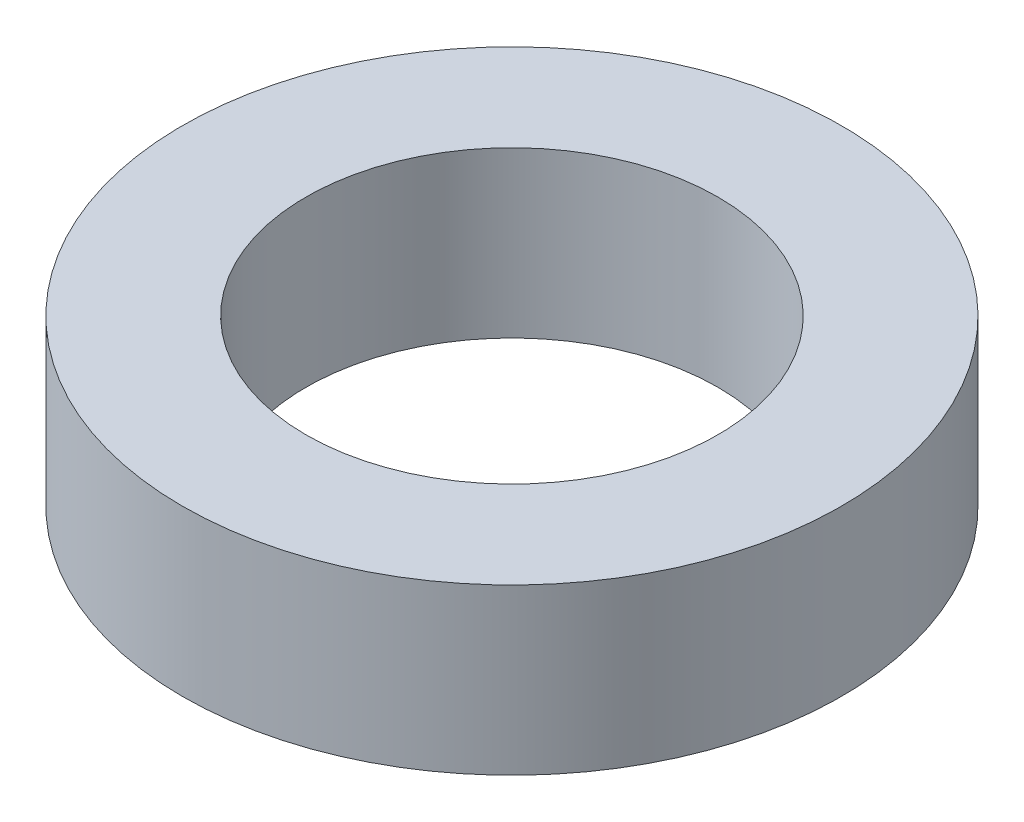
ISO-10303-21;
HEADER;
FILE_DESCRIPTION(('STEP AP214'),'2;1');
FILE_NAME('part.step','',(''),(''),'','','');
FILE_SCHEMA(('AUTOMOTIVE_DESIGN { 1 0 10303 214 1 1 1 1 }'));
ENDSEC;
DATA;
#1=APPLICATION_CONTEXT('core data for automotive mechanical design processes');
#2=APPLICATION_PROTOCOL_DEFINITION('international standard','automotive_design',2000,#1);
#3=PRODUCT_CONTEXT('',#1,'mechanical');
#4=PRODUCT('Part','Part','',(#3));
#5=PRODUCT_RELATED_PRODUCT_CATEGORY('part','',(#4));
#6=PRODUCT_DEFINITION_FORMATION('','',#4);
#7=PRODUCT_DEFINITION_CONTEXT('part definition',#1,'design');
#8=PRODUCT_DEFINITION('design','',#6,#7);
#9=PRODUCT_DEFINITION_SHAPE('','',#8);
#10=(LENGTH_UNIT() NAMED_UNIT(*) SI_UNIT(.MILLI.,.METRE.));
#11=(NAMED_UNIT(*) PLANE_ANGLE_UNIT() SI_UNIT($,.RADIAN.));
#12=(NAMED_UNIT(*) SI_UNIT($,.STERADIAN.) SOLID_ANGLE_UNIT());
#13=UNCERTAINTY_MEASURE_WITH_UNIT(LENGTH_MEASURE(1.E-05),#10,'distance_accuracy_value','');
#14=(GEOMETRIC_REPRESENTATION_CONTEXT(3) GLOBAL_UNCERTAINTY_ASSIGNED_CONTEXT((#13)) GLOBAL_UNIT_ASSIGNED_CONTEXT((#10,
#11,#12)) REPRESENTATION_CONTEXT('',''));
#15=CARTESIAN_POINT('',(0.,0.,0.));
#16=DIRECTION('',(0.,0.,1.));
#17=DIRECTION('',(1.,0.,0.));
#18=AXIS2_PLACEMENT_3D('',#15,#16,#17);
#19=CARTESIAN_POINT('',(0.,4.,0.));
#20=DIRECTION('',(0.,1.,0.));
#21=DIRECTION('',(0.,0.,1.));
#22=AXIS2_PLACEMENT_3D('',#19,#20,#21);
#23=PLANE('',#22);
#24=CARTESIAN_POINT('',(0.,4.,0.));
#25=DIRECTION('',(0.,1.,0.));
#26=DIRECTION('',(0.,0.,1.));
#27=AXIS2_PLACEMENT_3D('',#24,#25,#26);
#28=CIRCLE('',#27,8.);
#29=CARTESIAN_POINT('',(0.,4.,8.));
#30=VERTEX_POINT('',#29);
#31=EDGE_CURVE('E10',#30,#30,#28,.T.);
#32=ORIENTED_EDGE('',*,*,#31,.T.);
#33=EDGE_LOOP('',(#32));
#34=FACE_BOUND('',#33,.T.);
#35=CARTESIAN_POINT('',(0.,4.,0.));
#36=DIRECTION('',(0.,1.,0.));
#37=DIRECTION('',(0.,0.,1.));
#38=AXIS2_PLACEMENT_3D('',#35,#36,#37);
#39=CIRCLE('',#38,5.);
#40=CARTESIAN_POINT('',(0.,4.,5.));
#41=VERTEX_POINT('',#40);
#42=EDGE_CURVE('E49',#41,#41,#39,.T.);
#43=ORIENTED_EDGE('',*,*,#42,.F.);
#44=EDGE_LOOP('',(#43));
#45=FACE_BOUND('',#44,.T.);
#46=ADVANCED_FACE('F39',(#34,#45),#23,.T.);
#47=CARTESIAN_POINT('',(0.,0.,0.));
#48=DIRECTION('',(0.,1.,0.));
#49=DIRECTION('',(0.,0.,1.));
#50=AXIS2_PLACEMENT_3D('',#47,#48,#49);
#51=PLANE('',#50);
#52=CARTESIAN_POINT('',(0.,0.,0.));
#53=DIRECTION('',(0.,1.,0.));
#54=DIRECTION('',(0.,0.,1.));
#55=AXIS2_PLACEMENT_3D('',#52,#53,#54);
#56=CIRCLE('',#55,8.);
#57=CARTESIAN_POINT('',(0.,0.,8.));
#58=VERTEX_POINT('',#57);
#59=EDGE_CURVE('E43',#58,#58,#56,.T.);
#60=ORIENTED_EDGE('',*,*,#59,.F.);
#61=EDGE_LOOP('',(#60));
#62=FACE_BOUND('',#61,.T.);
#63=CARTESIAN_POINT('',(0.,0.,0.));
#64=DIRECTION('',(0.,1.,0.));
#65=DIRECTION('',(0.,0.,1.));
#66=AXIS2_PLACEMENT_3D('',#63,#64,#65);
#67=CIRCLE('',#66,5.);
#68=CARTESIAN_POINT('',(0.,0.,5.));
#69=VERTEX_POINT('',#68);
#70=EDGE_CURVE('E55',#69,#69,#67,.T.);
#71=ORIENTED_EDGE('',*,*,#70,.T.);
#72=EDGE_LOOP('',(#71));
#73=FACE_BOUND('',#72,.T.);
#74=ADVANCED_FACE('F62',(#62,#73),#51,.F.);
#75=CARTESIAN_POINT('',(0.,4.,0.));
#76=DIRECTION('',(0.,-1.,0.));
#77=DIRECTION('',(0.,0.,-1.));
#78=AXIS2_PLACEMENT_3D('',#75,#76,#77);
#79=CYLINDRICAL_SURFACE('',#78,8.);
#80=ORIENTED_EDGE('',*,*,#31,.F.);
#81=EDGE_LOOP('',(#80));
#82=FACE_BOUND('',#81,.T.);
#83=ORIENTED_EDGE('',*,*,#59,.T.);
#84=EDGE_LOOP('',(#83));
#85=FACE_BOUND('',#84,.T.);
#86=ADVANCED_FACE('F41',(#82,#85),#79,.T.);
#87=CARTESIAN_POINT('',(0.,4.,0.));
#88=DIRECTION('',(0.,-1.,0.));
#89=DIRECTION('',(0.,0.,-1.));
#90=AXIS2_PLACEMENT_3D('',#87,#88,#89);
#91=CYLINDRICAL_SURFACE('',#90,5.);
#92=ORIENTED_EDGE('',*,*,#42,.T.);
#93=EDGE_LOOP('',(#92));
#94=FACE_BOUND('',#93,.T.);
#95=ORIENTED_EDGE('',*,*,#70,.F.);
#96=EDGE_LOOP('',(#95));
#97=FACE_BOUND('',#96,.T.);
#98=ADVANCED_FACE('F59',(#94,#97),#91,.F.);
#99=CLOSED_SHELL('',(#46,#74,#86,#98));
#100=MANIFOLD_SOLID_BREP('B2',#99);
#101=ADVANCED_BREP_SHAPE_REPRESENTATION('',(#18,#100),#14);
#102=SHAPE_DEFINITION_REPRESENTATION(#9,#101);
ENDSEC;
END-ISO-10303-21;
